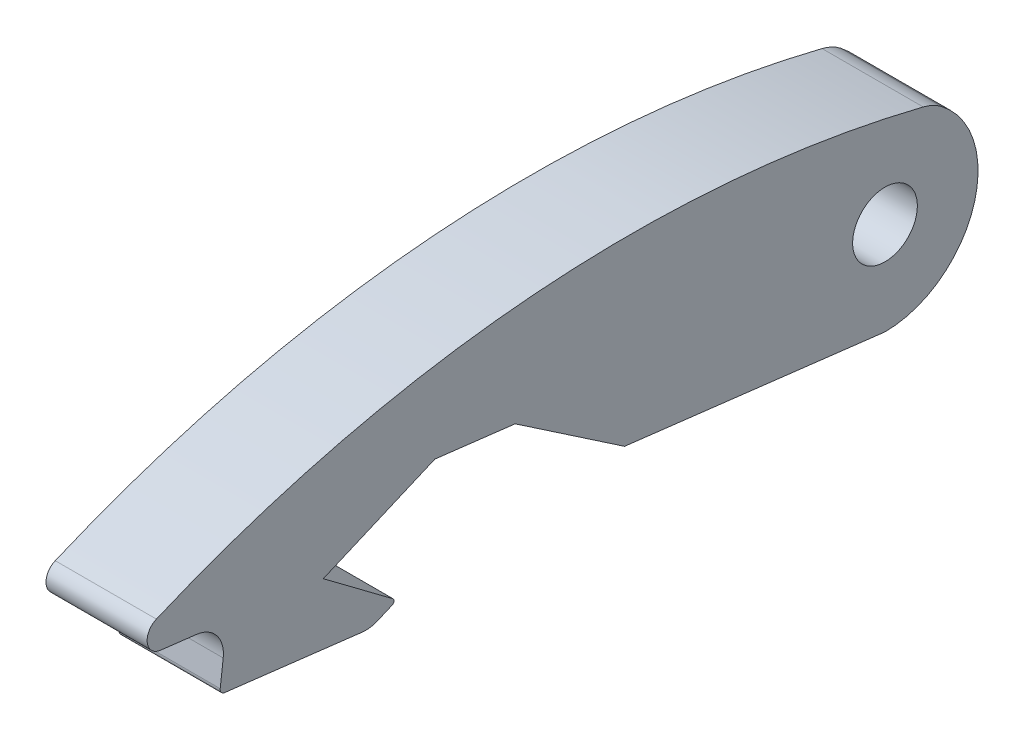
ISO-10303-21;
HEADER;
FILE_DESCRIPTION(('STEP AP214'),'2;1');
FILE_NAME('part.step','',(''),(''),'','','');
FILE_SCHEMA(('AUTOMOTIVE_DESIGN { 1 0 10303 214 1 1 1 1 }'));
ENDSEC;
DATA;
#1=APPLICATION_CONTEXT('core data for automotive mechanical design processes');
#2=APPLICATION_PROTOCOL_DEFINITION('international standard','automotive_design',2000,#1);
#3=PRODUCT_CONTEXT('',#1,'mechanical');
#4=PRODUCT('Part','Part','',(#3));
#5=PRODUCT_RELATED_PRODUCT_CATEGORY('part','',(#4));
#6=PRODUCT_DEFINITION_FORMATION('','',#4);
#7=PRODUCT_DEFINITION_CONTEXT('part definition',#1,'design');
#8=PRODUCT_DEFINITION('design','',#6,#7);
#9=PRODUCT_DEFINITION_SHAPE('','',#8);
#10=(LENGTH_UNIT() NAMED_UNIT(*) SI_UNIT(.MILLI.,.METRE.));
#11=(NAMED_UNIT(*) PLANE_ANGLE_UNIT() SI_UNIT($,.RADIAN.));
#12=(NAMED_UNIT(*) SI_UNIT($,.STERADIAN.) SOLID_ANGLE_UNIT());
#13=UNCERTAINTY_MEASURE_WITH_UNIT(LENGTH_MEASURE(1.E-05),#10,'distance_accuracy_value','');
#14=(GEOMETRIC_REPRESENTATION_CONTEXT(3) GLOBAL_UNCERTAINTY_ASSIGNED_CONTEXT((#13)) GLOBAL_UNIT_ASSIGNED_CONTEXT((#10,
#11,#12)) REPRESENTATION_CONTEXT('',''));
#15=CARTESIAN_POINT('',(0.,0.,0.));
#16=DIRECTION('',(0.,0.,1.));
#17=DIRECTION('',(1.,0.,0.));
#18=AXIS2_PLACEMENT_3D('',#15,#16,#17);
#19=CARTESIAN_POINT('',(5.,0.,0.));
#20=DIRECTION('',(1.,0.,0.));
#21=DIRECTION('',(0.,0.,-1.));
#22=AXIS2_PLACEMENT_3D('',#19,#20,#21);
#23=PLANE('',#22);
#24=CARTESIAN_POINT('',(5.,0.,0.));
#25=DIRECTION('',(1.,0.,0.));
#26=DIRECTION('',(0.,0.,-1.));
#27=AXIS2_PLACEMENT_3D('',#24,#25,#26);
#28=CIRCLE('',#27,4.6);
#29=CARTESIAN_POINT('',(5.,-4.6,0.));
#30=VERTEX_POINT('',#29);
#31=CARTESIAN_POINT('',(5.,3.64084408682994,-2.81145057495156));
#32=VERTEX_POINT('',#31);
#33=EDGE_CURVE('E220',#30,#32,#28,.T.);
#34=ORIENTED_EDGE('',*,*,#33,.T.);
#35=CARTESIAN_POINT('',(5.,1.66212447442241,-1.28348830595618));
#36=DIRECTION('',(1.,0.,0.));
#37=DIRECTION('',(0.,0.,-1.));
#38=AXIS2_PLACEMENT_3D('',#35,#36,#37);
#39=CIRCLE('',#38,2.5);
#40=CARTESIAN_POINT('',(5.,4.08793881116239,-1.8879920724182));
#41=VERTEX_POINT('',#40);
#42=EDGE_CURVE('E11',#32,#41,#39,.T.);
#43=ORIENTED_EDGE('',*,*,#42,.T.);
#44=CARTESIAN_POINT('',(5.,-54.1316052705971,12.6200983226702));
#45=DIRECTION('',(1.,0.,0.));
#46=DIRECTION('',(0.,0.,1.));
#47=AXIS2_PLACEMENT_3D('',#44,#45,#46);
#48=CIRCLE('',#47,60.);
#49=CARTESIAN_POINT('',(5.,1.11524148444118,36.0249252527141));
#50=VERTEX_POINT('',#49);
#51=EDGE_CURVE('E289',#41,#50,#48,.T.);
#52=ORIENTED_EDGE('',*,*,#51,.T.);
#53=CARTESIAN_POINT('',(5.,0.424655900003197,35.7323649160886));
#54=DIRECTION('',(1.,0.,0.));
#55=DIRECTION('',(0.,0.,-1.));
#56=AXIS2_PLACEMENT_3D('',#53,#54,#55);
#57=CIRCLE('',#56,0.75);
#58=CARTESIAN_POINT('',(5.,-0.320047395265856,35.8213424526662));
#59=VERTEX_POINT('',#58);
#60=EDGE_CURVE('E280',#50,#59,#57,.T.);
#61=ORIENTED_EDGE('',*,*,#60,.T.);
#62=DIRECTION('',(0.,-0.1186367154368,-0.9929377270254));
#63=VECTOR('',#62,1.);
#64=CARTESIAN_POINT('',(5.,0.,38.5));
#65=LINE('',#64,#63);
#66=CARTESIAN_POINT('',(5.,-0.533865219465602,34.0317802283857));
#67=VERTEX_POINT('',#66);
#68=EDGE_CURVE('E301',#59,#67,#65,.T.);
#69=ORIENTED_EDGE('',*,*,#68,.T.);
#70=CARTESIAN_POINT('',(5.,-2.0232718100037,34.2097353015409));
#71=DIRECTION('',(1.,0.,0.));
#72=DIRECTION('',(0.,0.,-1.));
#73=AXIS2_PLACEMENT_3D('',#70,#71,#72);
#74=CIRCLE('',#73,1.5);
#75=CARTESIAN_POINT('',(5.,-2.2012268831589,32.7203287110028));
#76=VERTEX_POINT('',#75);
#77=EDGE_CURVE('E238',#67,#76,#74,.F.);
#78=ORIENTED_EDGE('',*,*,#77,.T.);
#79=DIRECTION('',(0.,-0.9929377270254,0.118636715436801));
#80=VECTOR('',#79,1.);
#81=CARTESIAN_POINT('',(5.,-0.711820292620803,32.5423736378476));
#82=LINE('',#81,#80);
#83=CARTESIAN_POINT('',(5.,-3.44239904194065,32.8686246052988));
#84=VERTEX_POINT('',#83);
#85=EDGE_CURVE('E306',#76,#84,#82,.T.);
#86=ORIENTED_EDGE('',*,*,#85,.T.);
#87=CARTESIAN_POINT('',(5.,-3.47205822079985,32.6203901735425));
#88=DIRECTION('',(1.,0.,0.));
#89=DIRECTION('',(0.,0.,-1.));
#90=AXIS2_PLACEMENT_3D('',#87,#88,#89);
#91=CIRCLE('',#90,0.25);
#92=CARTESIAN_POINT('',(5.,-3.7202926525562,32.6500493524017));
#93=VERTEX_POINT('',#92);
#94=EDGE_CURVE('E262',#84,#93,#91,.T.);
#95=ORIENTED_EDGE('',*,*,#94,.T.);
#96=DIRECTION('',(0.,-0.118636715436801,-0.9929377270254));
#97=VECTOR('',#96,1.);
#98=CARTESIAN_POINT('',(5.,-3.690633473697,32.898283784158));
#99=LINE('',#98,#97);
#100=CARTESIAN_POINT('',(5.,-4.53272592133205,25.8503361246038));
#101=VERTEX_POINT('',#100);
#102=EDGE_CURVE('E174',#93,#101,#99,.T.);
#103=ORIENTED_EDGE('',*,*,#102,.T.);
#104=CARTESIAN_POINT('',(5.,-3.04331933079395,25.6723810514486));
#105=DIRECTION('',(1.,0.,0.));
#106=DIRECTION('',(0.,0.,-1.));
#107=AXIS2_PLACEMENT_3D('',#104,#105,#106);
#108=CIRCLE('',#107,1.5);
#109=CARTESIAN_POINT('',(5.,-4.42216081134151,25.0817913702643));
#110=VERTEX_POINT('',#109);
#111=EDGE_CURVE('E247',#101,#110,#108,.T.);
#112=ORIENTED_EDGE('',*,*,#111,.T.);
#113=DIRECTION('',(0.,-0.393726454122882,0.919227653698376));
#114=VECTOR('',#113,1.);
#115=CARTESIAN_POINT('',(5.,5.34107325560493,2.28770514646627));
#116=LINE('',#115,#114);
#117=CARTESIAN_POINT('',(5.,-4.11440678720941,24.3632823481834));
#118=VERTEX_POINT('',#117);
#119=EDGE_CURVE('E242',#110,#118,#116,.F.);
#120=ORIENTED_EDGE('',*,*,#119,.T.);
#121=CARTESIAN_POINT('',(5.,-3.97652263915465,24.4223413163019));
#122=DIRECTION('',(1.,0.,0.));
#123=DIRECTION('',(0.,0.,-1.));
#124=AXIS2_PLACEMENT_3D('',#121,#122,#123);
#125=CIRCLE('',#124,0.15);
#126=CARTESIAN_POINT('',(5.,-3.85643399841542,24.3324596253665));
#127=VERTEX_POINT('',#126);
#128=EDGE_CURVE('E170',#118,#127,#125,.T.);
#129=ORIENTED_EDGE('',*,*,#128,.T.);
#130=DIRECTION('',(0.,0.59921127290251,0.800590938261578));
#131=VECTOR('',#130,1.);
#132=CARTESIAN_POINT('',(5.,-4.87700062806501,22.968906513904));
#133=LINE('',#132,#131);
#134=CARTESIAN_POINT('',(5.,-1.28173299064991,27.7724521434735));
#135=VERTEX_POINT('',#134);
#136=EDGE_CURVE('E162',#127,#135,#133,.T.);
#137=ORIENTED_EDGE('',*,*,#136,.T.);
#138=DIRECTION('',(0.,0.393726454122889,-0.919227653698373));
#139=VECTOR('',#138,1.);
#140=CARTESIAN_POINT('',(5.,-1.28173299064991,27.7724521434735));
#141=LINE('',#140,#139);
#142=CARTESIAN_POINT('',(5.,1.08062573408746,22.2570862212832));
#143=VERTEX_POINT('',#142);
#144=EDGE_CURVE('E166',#135,#143,#141,.T.);
#145=ORIENTED_EDGE('',*,*,#144,.T.);
#146=DIRECTION('',(0.,-0.118636715436801,-0.9929377270254));
#147=VECTOR('',#146,1.);
#148=CARTESIAN_POINT('',(5.,0.606078872340255,18.2853353131816));
#149=LINE('',#148,#147);
#150=CARTESIAN_POINT('',(5.,0.606078872340255,18.2853353131816));
#151=VERTEX_POINT('',#150);
#152=EDGE_CURVE('E189',#143,#151,#149,.T.);
#153=ORIENTED_EDGE('',*,*,#152,.T.);
#154=DIRECTION('',(0.,-0.561329679467752,-0.827592285457417));
#155=VECTOR('',#154,1.);
#156=CARTESIAN_POINT('',(5.,-3.06128372220193,12.8783862380925));
#157=LINE('',#156,#155);
#158=CARTESIAN_POINT('',(5.,-3.06128372220193,12.8783862380925));
#159=VERTEX_POINT('',#158);
#160=EDGE_CURVE('E191',#151,#159,#157,.T.);
#161=ORIENTED_EDGE('',*,*,#160,.T.);
#162=DIRECTION('',(0.,-0.118636715436801,-0.9929377270254));
#163=VECTOR('',#162,1.);
#164=CARTESIAN_POINT('',(5.,-3.06128372220193,12.8783862380925));
#165=LINE('',#164,#163);
#166=EDGE_CURVE('E196',#159,#30,#165,.T.);
#167=ORIENTED_EDGE('',*,*,#166,.T.);
#168=EDGE_LOOP('',(#34,#43,#52,#61,#69,#78,#86,#95,#103,#112,#120,#129,#137,#145,#153,#161,#167));
#169=FACE_BOUND('',#168,.T.);
#170=CARTESIAN_POINT('',(5.,0.,0.));
#171=DIRECTION('',(1.,0.,0.));
#172=DIRECTION('',(0.,0.,-1.));
#173=AXIS2_PLACEMENT_3D('',#170,#171,#172);
#174=CIRCLE('',#173,1.6);
#175=CARTESIAN_POINT('',(5.,0.,-1.6));
#176=VERTEX_POINT('',#175);
#177=EDGE_CURVE('E202',#176,#176,#174,.T.);
#178=ORIENTED_EDGE('',*,*,#177,.F.);
#179=EDGE_LOOP('',(#178));
#180=FACE_BOUND('',#179,.T.);
#181=ADVANCED_FACE('F44',(#169,#180),#23,.T.);
#182=CARTESIAN_POINT('',(0.,0.,0.));
#183=DIRECTION('',(1.,0.,0.));
#184=DIRECTION('',(0.,0.,-1.));
#185=AXIS2_PLACEMENT_3D('',#182,#183,#184);
#186=PLANE('',#185);
#187=CARTESIAN_POINT('',(0.,-54.1316052705971,12.6200983226702));
#188=DIRECTION('',(1.,0.,0.));
#189=DIRECTION('',(0.,0.,1.));
#190=AXIS2_PLACEMENT_3D('',#187,#188,#189);
#191=CIRCLE('',#190,60.);
#192=CARTESIAN_POINT('',(0.,4.08793881116239,-1.8879920724182));
#193=VERTEX_POINT('',#192);
#194=CARTESIAN_POINT('',(0.,1.11524148444118,36.0249252527141));
#195=VERTEX_POINT('',#194);
#196=EDGE_CURVE('E201',#193,#195,#191,.T.);
#197=ORIENTED_EDGE('',*,*,#196,.F.);
#198=CARTESIAN_POINT('',(0.,1.66212447442241,-1.28348830595618));
#199=DIRECTION('',(1.,0.,0.));
#200=DIRECTION('',(0.,0.,-1.));
#201=AXIS2_PLACEMENT_3D('',#198,#199,#200);
#202=CIRCLE('',#201,2.5);
#203=CARTESIAN_POINT('',(0.,3.64084408682994,-2.81145057495156));
#204=VERTEX_POINT('',#203);
#205=EDGE_CURVE('E66',#193,#204,#202,.F.);
#206=ORIENTED_EDGE('',*,*,#205,.T.);
#207=CARTESIAN_POINT('',(0.,0.,0.));
#208=DIRECTION('',(1.,0.,0.));
#209=DIRECTION('',(0.,0.,-1.));
#210=AXIS2_PLACEMENT_3D('',#207,#208,#209);
#211=CIRCLE('',#210,4.6);
#212=CARTESIAN_POINT('',(0.,-4.6,0.));
#213=VERTEX_POINT('',#212);
#214=EDGE_CURVE('E199',#213,#204,#211,.T.);
#215=ORIENTED_EDGE('',*,*,#214,.F.);
#216=DIRECTION('',(0.,-0.118636715436801,-0.9929377270254));
#217=VECTOR('',#216,1.);
#218=CARTESIAN_POINT('',(0.,-3.06128372220193,12.8783862380925));
#219=LINE('',#218,#217);
#220=CARTESIAN_POINT('',(0.,-3.06128372220193,12.8783862380925));
#221=VERTEX_POINT('',#220);
#222=EDGE_CURVE('E218',#221,#213,#219,.T.);
#223=ORIENTED_EDGE('',*,*,#222,.F.);
#224=DIRECTION('',(0.,-0.561329679467752,-0.827592285457417));
#225=VECTOR('',#224,1.);
#226=CARTESIAN_POINT('',(0.,-3.06128372220193,12.8783862380925));
#227=LINE('',#226,#225);
#228=CARTESIAN_POINT('',(0.,0.606078872340255,18.2853353131816));
#229=VERTEX_POINT('',#228);
#230=EDGE_CURVE('E216',#229,#221,#227,.T.);
#231=ORIENTED_EDGE('',*,*,#230,.F.);
#232=DIRECTION('',(0.,-0.118636715436801,-0.9929377270254));
#233=VECTOR('',#232,1.);
#234=CARTESIAN_POINT('',(0.,0.606078872340255,18.2853353131816));
#235=LINE('',#234,#233);
#236=CARTESIAN_POINT('',(0.,1.08062573408746,22.2570862212832));
#237=VERTEX_POINT('',#236);
#238=EDGE_CURVE('E214',#237,#229,#235,.T.);
#239=ORIENTED_EDGE('',*,*,#238,.F.);
#240=DIRECTION('',(0.,0.393726454122889,-0.919227653698373));
#241=VECTOR('',#240,1.);
#242=CARTESIAN_POINT('',(0.,-1.28173299064991,27.7724521434735));
#243=LINE('',#242,#241);
#244=CARTESIAN_POINT('',(0.,-1.28173299064991,27.7724521434735));
#245=VERTEX_POINT('',#244);
#246=EDGE_CURVE('E212',#245,#237,#243,.T.);
#247=ORIENTED_EDGE('',*,*,#246,.F.);
#248=DIRECTION('',(0.,0.59921127290251,0.800590938261578));
#249=VECTOR('',#248,1.);
#250=CARTESIAN_POINT('',(0.,-4.87700062806501,22.968906513904));
#251=LINE('',#250,#249);
#252=CARTESIAN_POINT('',(0.,-3.85643399841542,24.3324596253665));
#253=VERTEX_POINT('',#252);
#254=EDGE_CURVE('E180',#253,#245,#251,.T.);
#255=ORIENTED_EDGE('',*,*,#254,.F.);
#256=CARTESIAN_POINT('',(0.,-3.97652263915465,24.4223413163019));
#257=DIRECTION('',(1.,0.,0.));
#258=DIRECTION('',(0.,0.,-1.));
#259=AXIS2_PLACEMENT_3D('',#256,#257,#258);
#260=CIRCLE('',#259,0.15);
#261=CARTESIAN_POINT('',(0.,-4.11440678720941,24.3632823481835));
#262=VERTEX_POINT('',#261);
#263=EDGE_CURVE('E266',#253,#262,#260,.F.);
#264=ORIENTED_EDGE('',*,*,#263,.T.);
#265=DIRECTION('',(0.,0.393726454122882,-0.919227653698376));
#266=VECTOR('',#265,1.);
#267=CARTESIAN_POINT('',(0.,-4.01211365378569,24.1244599981943));
#268=LINE('',#267,#266);
#269=CARTESIAN_POINT('',(0.,-4.42216081134151,25.0817913702643));
#270=VERTEX_POINT('',#269);
#271=EDGE_CURVE('E240',#262,#270,#268,.F.);
#272=ORIENTED_EDGE('',*,*,#271,.T.);
#273=CARTESIAN_POINT('',(0.,-3.04331933079395,25.6723810514486));
#274=DIRECTION('',(1.,0.,0.));
#275=DIRECTION('',(0.,0.,-1.));
#276=AXIS2_PLACEMENT_3D('',#273,#274,#275);
#277=CIRCLE('',#276,1.5);
#278=CARTESIAN_POINT('',(0.,-4.53272592133205,25.8503361246038));
#279=VERTEX_POINT('',#278);
#280=EDGE_CURVE('E252',#270,#279,#277,.F.);
#281=ORIENTED_EDGE('',*,*,#280,.T.);
#282=DIRECTION('',(0.,-0.118636715436801,-0.9929377270254));
#283=VECTOR('',#282,1.);
#284=CARTESIAN_POINT('',(0.,-3.690633473697,32.898283784158));
#285=LINE('',#284,#283);
#286=CARTESIAN_POINT('',(0.,-3.7202926525562,32.6500493524017));
#287=VERTEX_POINT('',#286);
#288=EDGE_CURVE('E209',#287,#279,#285,.T.);
#289=ORIENTED_EDGE('',*,*,#288,.F.);
#290=CARTESIAN_POINT('',(0.,-3.47205822079985,32.6203901735425));
#291=DIRECTION('',(1.,0.,0.));
#292=DIRECTION('',(0.,0.,-1.));
#293=AXIS2_PLACEMENT_3D('',#290,#291,#292);
#294=CIRCLE('',#293,0.25);
#295=CARTESIAN_POINT('',(0.,-3.44239904194065,32.8686246052988));
#296=VERTEX_POINT('',#295);
#297=EDGE_CURVE('E258',#287,#296,#294,.F.);
#298=ORIENTED_EDGE('',*,*,#297,.T.);
#299=DIRECTION('',(0.,-0.9929377270254,0.118636715436801));
#300=VECTOR('',#299,1.);
#301=CARTESIAN_POINT('',(0.,-0.711820292620803,32.5423736378476));
#302=LINE('',#301,#300);
#303=CARTESIAN_POINT('',(0.,-2.2012268831589,32.7203287110028));
#304=VERTEX_POINT('',#303);
#305=EDGE_CURVE('E206',#304,#296,#302,.T.);
#306=ORIENTED_EDGE('',*,*,#305,.F.);
#307=CARTESIAN_POINT('',(0.,-2.0232718100037,34.2097353015409));
#308=DIRECTION('',(1.,0.,0.));
#309=DIRECTION('',(0.,0.,-1.));
#310=AXIS2_PLACEMENT_3D('',#307,#308,#309);
#311=CIRCLE('',#310,1.5);
#312=CARTESIAN_POINT('',(0.,-0.533865219465602,34.0317802283857));
#313=VERTEX_POINT('',#312);
#314=EDGE_CURVE('E235',#304,#313,#311,.T.);
#315=ORIENTED_EDGE('',*,*,#314,.T.);
#316=DIRECTION('',(0.,-0.1186367154368,-0.9929377270254));
#317=VECTOR('',#316,1.);
#318=CARTESIAN_POINT('',(0.,0.,38.5));
#319=LINE('',#318,#317);
#320=CARTESIAN_POINT('',(0.,-0.320047395265856,35.8213424526662));
#321=VERTEX_POINT('',#320);
#322=EDGE_CURVE('E204',#321,#313,#319,.T.);
#323=ORIENTED_EDGE('',*,*,#322,.F.);
#324=CARTESIAN_POINT('',(0.,0.424655900003197,35.7323649160886));
#325=DIRECTION('',(1.,0.,0.));
#326=DIRECTION('',(0.,0.,-1.));
#327=AXIS2_PLACEMENT_3D('',#324,#325,#326);
#328=CIRCLE('',#327,0.75);
#329=EDGE_CURVE('E274',#321,#195,#328,.F.);
#330=ORIENTED_EDGE('',*,*,#329,.T.);
#331=EDGE_LOOP('',(#197,#206,#215,#223,#231,#239,#247,#255,#264,#272,#281,#289,#298,#306,#315,
#323,#330));
#332=FACE_BOUND('',#331,.T.);
#333=CARTESIAN_POINT('',(0.,0.,0.));
#334=DIRECTION('',(1.,0.,0.));
#335=DIRECTION('',(0.,0.,-1.));
#336=AXIS2_PLACEMENT_3D('',#333,#334,#335);
#337=CIRCLE('',#336,1.6);
#338=CARTESIAN_POINT('',(0.,0.,-1.6));
#339=VERTEX_POINT('',#338);
#340=EDGE_CURVE('E347',#339,#339,#337,.T.);
#341=ORIENTED_EDGE('',*,*,#340,.T.);
#342=EDGE_LOOP('',(#341));
#343=FACE_BOUND('',#342,.T.);
#344=ADVANCED_FACE('F292',(#332,#343),#186,.F.);
#345=CARTESIAN_POINT('',(5.,0.,0.));
#346=DIRECTION('',(-1.,0.,0.));
#347=DIRECTION('',(0.,0.,1.));
#348=AXIS2_PLACEMENT_3D('',#345,#346,#347);
#349=CYLINDRICAL_SURFACE('',#348,4.6);
#350=ORIENTED_EDGE('',*,*,#214,.T.);
#351=DIRECTION('',(-1.,0.,0.));
#352=VECTOR('',#351,1.);
#353=CARTESIAN_POINT('',(5.,3.64084408682994,-2.81145057495156));
#354=LINE('',#353,#352);
#355=EDGE_CURVE('E52',#204,#32,#354,.F.);
#356=ORIENTED_EDGE('',*,*,#355,.T.);
#357=ORIENTED_EDGE('',*,*,#33,.F.);
#358=DIRECTION('',(-1.,0.,0.));
#359=VECTOR('',#358,1.);
#360=CARTESIAN_POINT('',(5.,-4.6,0.));
#361=LINE('',#360,#359);
#362=EDGE_CURVE('E198',#30,#213,#361,.T.);
#363=ORIENTED_EDGE('',*,*,#362,.T.);
#364=EDGE_LOOP('',(#350,#356,#357,#363));
#365=FACE_BOUND('',#364,.T.);
#366=ADVANCED_FACE('F345',(#365),#349,.T.);
#367=CARTESIAN_POINT('',(5.,-54.1316052705971,12.6200983226702));
#368=DIRECTION('',(-1.,0.,0.));
#369=DIRECTION('',(0.,0.,1.));
#370=AXIS2_PLACEMENT_3D('',#367,#368,#369);
#371=CYLINDRICAL_SURFACE('',#370,60.);
#372=ORIENTED_EDGE('',*,*,#51,.F.);
#373=DIRECTION('',(-1.,0.,0.));
#374=VECTOR('',#373,1.);
#375=CARTESIAN_POINT('',(5.,4.0879388111624,-1.8879920724182));
#376=LINE('',#375,#374);
#377=EDGE_CURVE('E282',#41,#193,#376,.T.);
#378=ORIENTED_EDGE('',*,*,#377,.T.);
#379=ORIENTED_EDGE('',*,*,#196,.T.);
#380=DIRECTION('',(-1.,0.,0.));
#381=VECTOR('',#380,1.);
#382=CARTESIAN_POINT('',(5.,1.11524148444118,36.0249252527141));
#383=LINE('',#382,#381);
#384=EDGE_CURVE('E277',#195,#50,#383,.F.);
#385=ORIENTED_EDGE('',*,*,#384,.T.);
#386=EDGE_LOOP('',(#372,#378,#379,#385));
#387=FACE_BOUND('',#386,.T.);
#388=ADVANCED_FACE('F288',(#387),#371,.T.);
#389=CARTESIAN_POINT('',(5.,0.,38.5));
#390=DIRECTION('',(0.,0.9929377270254,-0.1186367154368));
#391=DIRECTION('',(0.,0.1186367154368,0.9929377270254));
#392=AXIS2_PLACEMENT_3D('',#389,#390,#391);
#393=PLANE('',#392);
#394=ORIENTED_EDGE('',*,*,#68,.F.);
#395=DIRECTION('',(-1.,0.,0.));
#396=VECTOR('',#395,1.);
#397=CARTESIAN_POINT('',(5.,-0.320047395265856,35.8213424526662));
#398=LINE('',#397,#396);
#399=EDGE_CURVE('E271',#59,#321,#398,.T.);
#400=ORIENTED_EDGE('',*,*,#399,.T.);
#401=ORIENTED_EDGE('',*,*,#322,.T.);
#402=DIRECTION('',(-1.,0.,0.));
#403=VECTOR('',#402,1.);
#404=CARTESIAN_POINT('',(5.,-0.533865219465602,34.0317802283857));
#405=LINE('',#404,#403);
#406=EDGE_CURVE('E232',#313,#67,#405,.F.);
#407=ORIENTED_EDGE('',*,*,#406,.T.);
#408=EDGE_LOOP('',(#394,#400,#401,#407));
#409=FACE_BOUND('',#408,.T.);
#410=ADVANCED_FACE('F303',(#409),#393,.F.);
#411=CARTESIAN_POINT('',(5.,-0.711820292620803,32.5423736378476));
#412=DIRECTION('',(0.,-0.118636715436801,-0.9929377270254));
#413=DIRECTION('',(0.,0.9929377270254,-0.118636715436801));
#414=AXIS2_PLACEMENT_3D('',#411,#412,#413);
#415=PLANE('',#414);
#416=ORIENTED_EDGE('',*,*,#305,.T.);
#417=DIRECTION('',(-1.,0.,0.));
#418=VECTOR('',#417,1.);
#419=CARTESIAN_POINT('',(5.,-3.44239904194065,32.8686246052988));
#420=LINE('',#419,#418);
#421=EDGE_CURVE('E260',#296,#84,#420,.F.);
#422=ORIENTED_EDGE('',*,*,#421,.T.);
#423=ORIENTED_EDGE('',*,*,#85,.F.);
#424=DIRECTION('',(-1.,0.,0.));
#425=VECTOR('',#424,1.);
#426=CARTESIAN_POINT('',(0.,-2.2012268831589,32.7203287110028));
#427=LINE('',#426,#425);
#428=EDGE_CURVE('E183',#76,#304,#427,.T.);
#429=ORIENTED_EDGE('',*,*,#428,.T.);
#430=EDGE_LOOP('',(#416,#422,#423,#429));
#431=FACE_BOUND('',#430,.T.);
#432=ADVANCED_FACE('F376',(#431),#415,.F.);
#433=CARTESIAN_POINT('',(5.,-3.690633473697,32.898283784158));
#434=DIRECTION('',(0.,0.9929377270254,-0.118636715436801));
#435=DIRECTION('',(0.,0.118636715436801,0.9929377270254));
#436=AXIS2_PLACEMENT_3D('',#433,#434,#435);
#437=PLANE('',#436);
#438=ORIENTED_EDGE('',*,*,#102,.F.);
#439=DIRECTION('',(-1.,0.,0.));
#440=VECTOR('',#439,1.);
#441=CARTESIAN_POINT('',(5.,-3.7202926525562,32.6500493524017));
#442=LINE('',#441,#440);
#443=EDGE_CURVE('E255',#93,#287,#442,.T.);
#444=ORIENTED_EDGE('',*,*,#443,.T.);
#445=ORIENTED_EDGE('',*,*,#288,.T.);
#446=DIRECTION('',(-1.,0.,0.));
#447=VECTOR('',#446,1.);
#448=CARTESIAN_POINT('',(5.,-4.53272592133205,25.8503361246038));
#449=LINE('',#448,#447);
#450=EDGE_CURVE('E244',#279,#101,#449,.F.);
#451=ORIENTED_EDGE('',*,*,#450,.T.);
#452=EDGE_LOOP('',(#438,#444,#445,#451));
#453=FACE_BOUND('',#452,.T.);
#454=ADVANCED_FACE('F323',(#453),#437,.F.);
#455=CARTESIAN_POINT('',(5.,-4.87700062806501,22.968906513904));
#456=DIRECTION('',(0.,-0.800590938261578,0.59921127290251));
#457=DIRECTION('',(0.,-0.59921127290251,-0.800590938261578));
#458=AXIS2_PLACEMENT_3D('',#455,#456,#457);
#459=PLANE('',#458);
#460=ORIENTED_EDGE('',*,*,#136,.F.);
#461=DIRECTION('',(1.,0.,0.));
#462=VECTOR('',#461,1.);
#463=CARTESIAN_POINT('',(0.,-3.85643399841542,24.3324596253665));
#464=LINE('',#463,#462);
#465=EDGE_CURVE('E264',#127,#253,#464,.F.);
#466=ORIENTED_EDGE('',*,*,#465,.T.);
#467=ORIENTED_EDGE('',*,*,#254,.T.);
#468=DIRECTION('',(-1.,0.,0.));
#469=VECTOR('',#468,1.);
#470=CARTESIAN_POINT('',(5.,-1.28173299064991,27.7724521434735));
#471=LINE('',#470,#469);
#472=EDGE_CURVE('E177',#135,#245,#471,.T.);
#473=ORIENTED_EDGE('',*,*,#472,.F.);
#474=EDGE_LOOP('',(#460,#466,#467,#473));
#475=FACE_BOUND('',#474,.T.);
#476=ADVANCED_FACE('F178',(#475),#459,.F.);
#477=CARTESIAN_POINT('',(5.,-1.28173299064991,27.7724521434735));
#478=DIRECTION('',(0.,0.919227653698373,0.393726454122889));
#479=DIRECTION('',(0.,-0.393726454122889,0.919227653698373));
#480=AXIS2_PLACEMENT_3D('',#477,#478,#479);
#481=PLANE('',#480);
#482=ORIENTED_EDGE('',*,*,#246,.T.);
#483=DIRECTION('',(-1.,0.,0.));
#484=VECTOR('',#483,1.);
#485=CARTESIAN_POINT('',(5.,1.08062573408746,22.2570862212832));
#486=LINE('',#485,#484);
#487=EDGE_CURVE('E184',#143,#237,#486,.T.);
#488=ORIENTED_EDGE('',*,*,#487,.F.);
#489=ORIENTED_EDGE('',*,*,#144,.F.);
#490=ORIENTED_EDGE('',*,*,#472,.T.);
#491=EDGE_LOOP('',(#482,#488,#489,#490));
#492=FACE_BOUND('',#491,.T.);
#493=ADVANCED_FACE('F186',(#492),#481,.F.);
#494=CARTESIAN_POINT('',(5.,0.606078872340255,18.2853353131816));
#495=DIRECTION('',(0.,0.9929377270254,-0.118636715436801));
#496=DIRECTION('',(0.,0.118636715436801,0.9929377270254));
#497=AXIS2_PLACEMENT_3D('',#494,#495,#496);
#498=PLANE('',#497);
#499=ORIENTED_EDGE('',*,*,#238,.T.);
#500=DIRECTION('',(-1.,0.,0.));
#501=VECTOR('',#500,1.);
#502=CARTESIAN_POINT('',(5.,0.606078872340255,18.2853353131816));
#503=LINE('',#502,#501);
#504=EDGE_CURVE('E226',#151,#229,#503,.T.);
#505=ORIENTED_EDGE('',*,*,#504,.F.);
#506=ORIENTED_EDGE('',*,*,#152,.F.);
#507=ORIENTED_EDGE('',*,*,#487,.T.);
#508=EDGE_LOOP('',(#499,#505,#506,#507));
#509=FACE_BOUND('',#508,.T.);
#510=ADVANCED_FACE('F334',(#509),#498,.F.);
#511=CARTESIAN_POINT('',(5.,-3.06128372220193,12.8783862380925));
#512=DIRECTION('',(0.,0.827592285457417,-0.561329679467752));
#513=DIRECTION('',(0.,0.561329679467752,0.827592285457417));
#514=AXIS2_PLACEMENT_3D('',#511,#512,#513);
#515=PLANE('',#514);
#516=ORIENTED_EDGE('',*,*,#230,.T.);
#517=DIRECTION('',(-1.,0.,0.));
#518=VECTOR('',#517,1.);
#519=CARTESIAN_POINT('',(5.,-3.06128372220193,12.8783862380925));
#520=LINE('',#519,#518);
#521=EDGE_CURVE('E223',#159,#221,#520,.T.);
#522=ORIENTED_EDGE('',*,*,#521,.F.);
#523=ORIENTED_EDGE('',*,*,#160,.F.);
#524=ORIENTED_EDGE('',*,*,#504,.T.);
#525=EDGE_LOOP('',(#516,#522,#523,#524));
#526=FACE_BOUND('',#525,.T.);
#527=ADVANCED_FACE('F341',(#526),#515,.F.);
#528=CARTESIAN_POINT('',(5.,-3.06128372220193,12.8783862380925));
#529=DIRECTION('',(0.,0.9929377270254,-0.118636715436801));
#530=DIRECTION('',(0.,0.118636715436801,0.9929377270254));
#531=AXIS2_PLACEMENT_3D('',#528,#529,#530);
#532=PLANE('',#531);
#533=ORIENTED_EDGE('',*,*,#222,.T.);
#534=ORIENTED_EDGE('',*,*,#362,.F.);
#535=ORIENTED_EDGE('',*,*,#166,.F.);
#536=ORIENTED_EDGE('',*,*,#521,.T.);
#537=EDGE_LOOP('',(#533,#534,#535,#536));
#538=FACE_BOUND('',#537,.T.);
#539=ADVANCED_FACE('F344',(#538),#532,.F.);
#540=CARTESIAN_POINT('',(5.,0.,0.));
#541=DIRECTION('',(-1.,0.,0.));
#542=DIRECTION('',(0.,0.,1.));
#543=AXIS2_PLACEMENT_3D('',#540,#541,#542);
#544=CYLINDRICAL_SURFACE('',#543,1.6);
#545=ORIENTED_EDGE('',*,*,#177,.T.);
#546=EDGE_LOOP('',(#545));
#547=FACE_BOUND('',#546,.T.);
#548=ORIENTED_EDGE('',*,*,#340,.F.);
#549=EDGE_LOOP('',(#548));
#550=FACE_BOUND('',#549,.T.);
#551=ADVANCED_FACE('F353',(#547,#550),#544,.F.);
#552=CARTESIAN_POINT('',(5.,-2.0232718100037,34.2097353015409));
#553=DIRECTION('',(1.,0.,0.));
#554=DIRECTION('',(0.,0.,-1.));
#555=AXIS2_PLACEMENT_3D('',#552,#553,#554);
#556=CYLINDRICAL_SURFACE('',#555,1.5);
#557=ORIENTED_EDGE('',*,*,#77,.F.);
#558=ORIENTED_EDGE('',*,*,#406,.F.);
#559=ORIENTED_EDGE('',*,*,#314,.F.);
#560=ORIENTED_EDGE('',*,*,#428,.F.);
#561=EDGE_LOOP('',(#557,#558,#559,#560));
#562=FACE_BOUND('',#561,.T.);
#563=ADVANCED_FACE('F386',(#562),#556,.F.);
#564=CARTESIAN_POINT('',(5.,-4.01211365378569,24.1244599981943));
#565=DIRECTION('',(0.,0.919227653698376,0.393726454122882));
#566=DIRECTION('',(-1.,0.,0.));
#567=AXIS2_PLACEMENT_3D('',#564,#565,#566);
#568=PLANE('',#567);
#569=ORIENTED_EDGE('',*,*,#271,.F.);
#570=DIRECTION('',(-1.,0.,0.));
#571=VECTOR('',#570,1.);
#572=CARTESIAN_POINT('',(5.,-4.11440678720941,24.3632823481835));
#573=LINE('',#572,#571);
#574=EDGE_CURVE('E268',#262,#118,#573,.F.);
#575=ORIENTED_EDGE('',*,*,#574,.T.);
#576=ORIENTED_EDGE('',*,*,#119,.F.);
#577=DIRECTION('',(1.,0.,0.));
#578=VECTOR('',#577,1.);
#579=CARTESIAN_POINT('',(0.,-4.42216081134151,25.0817913702643));
#580=LINE('',#579,#578);
#581=EDGE_CURVE('E249',#110,#270,#580,.F.);
#582=ORIENTED_EDGE('',*,*,#581,.T.);
#583=EDGE_LOOP('',(#569,#575,#576,#582));
#584=FACE_BOUND('',#583,.T.);
#585=ADVANCED_FACE('F328',(#584),#568,.F.);
#586=CARTESIAN_POINT('',(5.,-3.04331933079395,25.6723810514486));
#587=DIRECTION('',(1.,0.,0.));
#588=DIRECTION('',(0.,0.,-1.));
#589=AXIS2_PLACEMENT_3D('',#586,#587,#588);
#590=CYLINDRICAL_SURFACE('',#589,1.5);
#591=ORIENTED_EDGE('',*,*,#280,.F.);
#592=ORIENTED_EDGE('',*,*,#581,.F.);
#593=ORIENTED_EDGE('',*,*,#111,.F.);
#594=ORIENTED_EDGE('',*,*,#450,.F.);
#595=EDGE_LOOP('',(#591,#592,#593,#594));
#596=FACE_BOUND('',#595,.T.);
#597=ADVANCED_FACE('F322',(#596),#590,.T.);
#598=CARTESIAN_POINT('',(5.,-3.47205822079985,32.6203901735425));
#599=DIRECTION('',(-1.,0.,0.));
#600=DIRECTION('',(0.,0.,1.));
#601=AXIS2_PLACEMENT_3D('',#598,#599,#600);
#602=CYLINDRICAL_SURFACE('',#601,0.25);
#603=ORIENTED_EDGE('',*,*,#94,.F.);
#604=ORIENTED_EDGE('',*,*,#421,.F.);
#605=ORIENTED_EDGE('',*,*,#297,.F.);
#606=ORIENTED_EDGE('',*,*,#443,.F.);
#607=EDGE_LOOP('',(#603,#604,#605,#606));
#608=FACE_BOUND('',#607,.T.);
#609=ADVANCED_FACE('F397',(#608),#602,.T.);
#610=CARTESIAN_POINT('',(5.,-3.97652263915465,24.4223413163019));
#611=DIRECTION('',(-1.,0.,0.));
#612=DIRECTION('',(0.,0.,1.));
#613=AXIS2_PLACEMENT_3D('',#610,#611,#612);
#614=CYLINDRICAL_SURFACE('',#613,0.15);
#615=ORIENTED_EDGE('',*,*,#128,.F.);
#616=ORIENTED_EDGE('',*,*,#574,.F.);
#617=ORIENTED_EDGE('',*,*,#263,.F.);
#618=ORIENTED_EDGE('',*,*,#465,.F.);
#619=EDGE_LOOP('',(#615,#616,#617,#618));
#620=FACE_BOUND('',#619,.T.);
#621=ADVANCED_FACE('F330',(#620),#614,.T.);
#622=CARTESIAN_POINT('',(5.,0.424655900003197,35.7323649160886));
#623=DIRECTION('',(-1.,0.,0.));
#624=DIRECTION('',(0.,0.,1.));
#625=AXIS2_PLACEMENT_3D('',#622,#623,#624);
#626=CYLINDRICAL_SURFACE('',#625,0.75);
#627=ORIENTED_EDGE('',*,*,#60,.F.);
#628=ORIENTED_EDGE('',*,*,#384,.F.);
#629=ORIENTED_EDGE('',*,*,#329,.F.);
#630=ORIENTED_EDGE('',*,*,#399,.F.);
#631=EDGE_LOOP('',(#627,#628,#629,#630));
#632=FACE_BOUND('',#631,.T.);
#633=ADVANCED_FACE('F299',(#632),#626,.T.);
#634=CARTESIAN_POINT('',(5.,1.66212447442241,-1.28348830595618));
#635=DIRECTION('',(-1.,0.,0.));
#636=DIRECTION('',(0.,0.,1.));
#637=AXIS2_PLACEMENT_3D('',#634,#635,#636);
#638=CYLINDRICAL_SURFACE('',#637,2.5);
#639=ORIENTED_EDGE('',*,*,#42,.F.);
#640=ORIENTED_EDGE('',*,*,#355,.F.);
#641=ORIENTED_EDGE('',*,*,#205,.F.);
#642=ORIENTED_EDGE('',*,*,#377,.F.);
#643=EDGE_LOOP('',(#639,#640,#641,#642));
#644=FACE_BOUND('',#643,.T.);
#645=ADVANCED_FACE('F46',(#644),#638,.T.);
#646=CLOSED_SHELL('',(#181,#344,#366,#388,#410,#432,#454,#476,#493,#510,#527,#539,#551,#563,
#585,#597,#609,#621,#633,#645));
#647=MANIFOLD_SOLID_BREP('B2',#646);
#648=ADVANCED_BREP_SHAPE_REPRESENTATION('',(#18,#647),#14);
#649=SHAPE_DEFINITION_REPRESENTATION(#9,#648);
ENDSEC;
END-ISO-10303-21;
